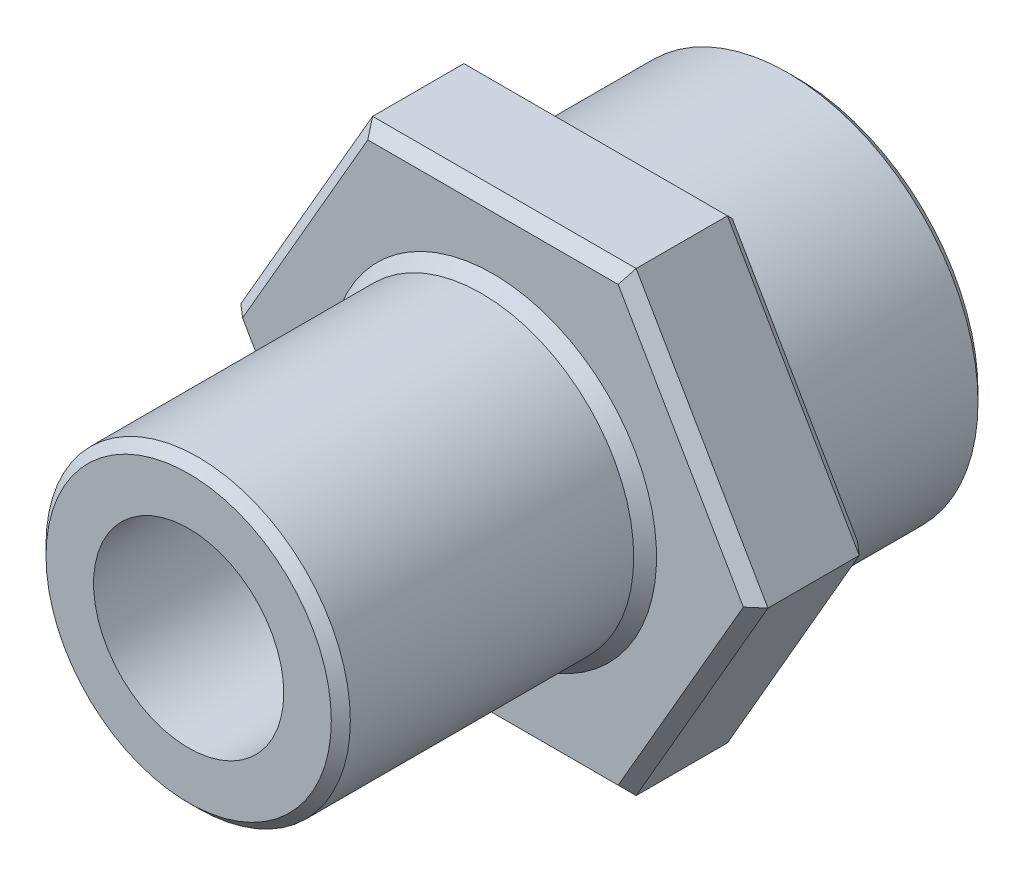
ISO-10303-21;
HEADER;
FILE_DESCRIPTION(('STEP AP214'),'2;1');
FILE_NAME('part.step','',(''),(''),'','','');
FILE_SCHEMA(('AUTOMOTIVE_DESIGN { 1 0 10303 214 1 1 1 1 }'));
ENDSEC;
DATA;
#1=APPLICATION_CONTEXT('core data for automotive mechanical design processes');
#2=APPLICATION_PROTOCOL_DEFINITION('international standard','automotive_design',2000,#1);
#3=PRODUCT_CONTEXT('',#1,'mechanical');
#4=PRODUCT('Part','Part','',(#3));
#5=PRODUCT_RELATED_PRODUCT_CATEGORY('part','',(#4));
#6=PRODUCT_DEFINITION_FORMATION('','',#4);
#7=PRODUCT_DEFINITION_CONTEXT('part definition',#1,'design');
#8=PRODUCT_DEFINITION('design','',#6,#7);
#9=PRODUCT_DEFINITION_SHAPE('','',#8);
#10=(LENGTH_UNIT() NAMED_UNIT(*) SI_UNIT(.MILLI.,.METRE.));
#11=(NAMED_UNIT(*) PLANE_ANGLE_UNIT() SI_UNIT($,.RADIAN.));
#12=(NAMED_UNIT(*) SI_UNIT($,.STERADIAN.) SOLID_ANGLE_UNIT());
#13=UNCERTAINTY_MEASURE_WITH_UNIT(LENGTH_MEASURE(1.E-05),#10,'distance_accuracy_value','');
#14=(GEOMETRIC_REPRESENTATION_CONTEXT(3) GLOBAL_UNCERTAINTY_ASSIGNED_CONTEXT((#13)) GLOBAL_UNIT_ASSIGNED_CONTEXT((#10,
#11,#12)) REPRESENTATION_CONTEXT('',''));
#15=CARTESIAN_POINT('',(0.,0.,0.));
#16=DIRECTION('',(0.,0.,1.));
#17=DIRECTION('',(1.,0.,0.));
#18=AXIS2_PLACEMENT_3D('',#15,#16,#17);
#19=CARTESIAN_POINT('',(0.,0.,8.));
#20=DIRECTION('',(0.,0.,-1.));
#21=DIRECTION('',(-1.,0.,0.));
#22=AXIS2_PLACEMENT_3D('',#19,#20,#21);
#23=CYLINDRICAL_SURFACE('',#22,4.);
#24=CARTESIAN_POINT('',(0.,0.,7.74999999999999));
#25=DIRECTION('',(0.,0.,1.));
#26=DIRECTION('',(1.,0.,0.));
#27=AXIS2_PLACEMENT_3D('',#24,#25,#26);
#28=CIRCLE('',#27,4.);
#29=CARTESIAN_POINT('',(4.,0.,7.74999999999999));
#30=VERTEX_POINT('',#29);
#31=EDGE_CURVE('E11',#30,#30,#28,.F.);
#32=ORIENTED_EDGE('',*,*,#31,.T.);
#33=EDGE_LOOP('',(#32));
#34=FACE_BOUND('',#33,.T.);
#35=CARTESIAN_POINT('',(0.,0.,0.299999999999998));
#36=DIRECTION('',(0.,0.,-1.));
#37=DIRECTION('',(-1.,0.,0.));
#38=AXIS2_PLACEMENT_3D('',#35,#36,#37);
#39=CIRCLE('',#38,4.);
#40=CARTESIAN_POINT('',(-4.,0.,0.299999999999998));
#41=VERTEX_POINT('',#40);
#42=EDGE_CURVE('E241',#41,#41,#39,.F.);
#43=ORIENTED_EDGE('',*,*,#42,.T.);
#44=EDGE_LOOP('',(#43));
#45=FACE_BOUND('',#44,.T.);
#46=ADVANCED_FACE('F44',(#34,#45),#23,.T.);
#47=CARTESIAN_POINT('',(0.,0.,8.));
#48=DIRECTION('',(0.,0.,1.));
#49=DIRECTION('',(1.,0.,0.));
#50=AXIS2_PLACEMENT_3D('',#47,#48,#49);
#51=PLANE('',#50);
#52=CARTESIAN_POINT('',(0.,0.,8.));
#53=DIRECTION('',(0.,0.,1.));
#54=DIRECTION('',(1.,0.,0.));
#55=AXIS2_PLACEMENT_3D('',#52,#53,#54);
#56=CIRCLE('',#55,3.74999999999999);
#57=CARTESIAN_POINT('',(3.74999999999999,0.,8.));
#58=VERTEX_POINT('',#57);
#59=EDGE_CURVE('E54',#58,#58,#56,.T.);
#60=ORIENTED_EDGE('',*,*,#59,.T.);
#61=EDGE_LOOP('',(#60));
#62=FACE_BOUND('',#61,.T.);
#63=CARTESIAN_POINT('',(0.,0.,8.));
#64=DIRECTION('',(0.,0.,1.));
#65=DIRECTION('',(1.,0.,0.));
#66=AXIS2_PLACEMENT_3D('',#63,#64,#65);
#67=CIRCLE('',#66,2.5);
#68=CARTESIAN_POINT('',(2.5,0.,8.));
#69=VERTEX_POINT('',#68);
#70=EDGE_CURVE('E229',#69,#69,#67,.T.);
#71=ORIENTED_EDGE('',*,*,#70,.F.);
#72=EDGE_LOOP('',(#71));
#73=FACE_BOUND('',#72,.T.);
#74=ADVANCED_FACE('F461',(#62,#73),#51,.T.);
#75=CARTESIAN_POINT('',(-3.46410161513776,6.,-3.));
#76=DIRECTION('',(0.,-1.,0.));
#77=DIRECTION('',(1.,0.,0.));
#78=AXIS2_PLACEMENT_3D('',#75,#76,#77);
#79=PLANE('',#78);
#80=DIRECTION('',(0.,0.,1.));
#81=VECTOR('',#80,1.);
#82=CARTESIAN_POINT('',(-3.46410161513776,6.,-3.));
#83=LINE('',#82,#81);
#84=CARTESIAN_POINT('',(-3.46410161513776,6.,-2.7));
#85=VERTEX_POINT('',#84);
#86=CARTESIAN_POINT('',(-3.46410161513776,6.,-0.300000000000002));
#87=VERTEX_POINT('',#86);
#88=EDGE_CURVE('E236',#85,#87,#83,.T.);
#89=ORIENTED_EDGE('',*,*,#88,.T.);
#90=DIRECTION('',(1.,0.,0.));
#91=VECTOR('',#90,1.);
#92=CARTESIAN_POINT('',(-3.46410161513776,6.,-0.300000000000002));
#93=LINE('',#92,#91);
#94=CARTESIAN_POINT('',(3.46410161513776,6.,-0.300000000000002));
#95=VERTEX_POINT('',#94);
#96=EDGE_CURVE('E331',#87,#95,#93,.T.);
#97=ORIENTED_EDGE('',*,*,#96,.T.);
#98=DIRECTION('',(0.,0.,1.));
#99=VECTOR('',#98,1.);
#100=CARTESIAN_POINT('',(3.46410161513776,6.,-3.));
#101=LINE('',#100,#99);
#102=CARTESIAN_POINT('',(3.46410161513776,6.,-2.7));
#103=VERTEX_POINT('',#102);
#104=EDGE_CURVE('E242',#103,#95,#101,.T.);
#105=ORIENTED_EDGE('',*,*,#104,.F.);
#106=DIRECTION('',(-1.,0.,0.));
#107=VECTOR('',#106,1.);
#108=CARTESIAN_POINT('',(-3.46410161513776,6.,-2.7));
#109=LINE('',#108,#107);
#110=EDGE_CURVE('E328',#103,#85,#109,.T.);
#111=ORIENTED_EDGE('',*,*,#110,.T.);
#112=EDGE_LOOP('',(#89,#97,#105,#111));
#113=FACE_BOUND('',#112,.T.);
#114=ADVANCED_FACE('F479',(#113),#79,.F.);
#115=CARTESIAN_POINT('',(3.46410161513776,6.,-3.));
#116=DIRECTION('',(-0.866025403784439,-0.5,0.));
#117=DIRECTION('',(0.5,-0.866025403784439,0.));
#118=AXIS2_PLACEMENT_3D('',#115,#116,#117);
#119=PLANE('',#118);
#120=ORIENTED_EDGE('',*,*,#104,.T.);
#121=DIRECTION('',(0.5,-0.866025403784439,0.));
#122=VECTOR('',#121,1.);
#123=CARTESIAN_POINT('',(3.46410161513776,6.,-0.300000000000002));
#124=LINE('',#123,#122);
#125=CARTESIAN_POINT('',(6.92820323027551,0.,-0.300000000000002));
#126=VERTEX_POINT('',#125);
#127=EDGE_CURVE('E280',#95,#126,#124,.T.);
#128=ORIENTED_EDGE('',*,*,#127,.T.);
#129=DIRECTION('',(0.,0.,1.));
#130=VECTOR('',#129,1.);
#131=CARTESIAN_POINT('',(6.92820323027551,0.,-3.));
#132=LINE('',#131,#130);
#133=CARTESIAN_POINT('',(6.92820323027551,0.,-2.7));
#134=VERTEX_POINT('',#133);
#135=EDGE_CURVE('E258',#134,#126,#132,.T.);
#136=ORIENTED_EDGE('',*,*,#135,.F.);
#137=DIRECTION('',(-0.5,0.866025403784439,0.));
#138=VECTOR('',#137,1.);
#139=CARTESIAN_POINT('',(3.46410161513776,6.,-2.7));
#140=LINE('',#139,#138);
#141=EDGE_CURVE('E218',#134,#103,#140,.T.);
#142=ORIENTED_EDGE('',*,*,#141,.T.);
#143=EDGE_LOOP('',(#120,#128,#136,#142));
#144=FACE_BOUND('',#143,.T.);
#145=ADVANCED_FACE('F530',(#144),#119,.F.);
#146=CARTESIAN_POINT('',(6.92820323027551,0.,-3.));
#147=DIRECTION('',(-0.866025403784439,0.5,0.));
#148=DIRECTION('',(-0.5,-0.866025403784439,0.));
#149=AXIS2_PLACEMENT_3D('',#146,#147,#148);
#150=PLANE('',#149);
#151=ORIENTED_EDGE('',*,*,#135,.T.);
#152=DIRECTION('',(-0.5,-0.866025403784439,0.));
#153=VECTOR('',#152,1.);
#154=CARTESIAN_POINT('',(6.92820323027551,0.,-0.300000000000002));
#155=LINE('',#154,#153);
#156=CARTESIAN_POINT('',(3.46410161513776,-6.,-0.300000000000002));
#157=VERTEX_POINT('',#156);
#158=EDGE_CURVE('E306',#126,#157,#155,.T.);
#159=ORIENTED_EDGE('',*,*,#158,.T.);
#160=DIRECTION('',(0.,0.,1.));
#161=VECTOR('',#160,1.);
#162=CARTESIAN_POINT('',(3.46410161513776,-6.,-3.));
#163=LINE('',#162,#161);
#164=CARTESIAN_POINT('',(3.46410161513776,-6.,-2.7));
#165=VERTEX_POINT('',#164);
#166=EDGE_CURVE('E254',#165,#157,#163,.T.);
#167=ORIENTED_EDGE('',*,*,#166,.F.);
#168=DIRECTION('',(0.5,0.866025403784439,0.));
#169=VECTOR('',#168,1.);
#170=CARTESIAN_POINT('',(6.92820323027551,0.,-2.7));
#171=LINE('',#170,#169);
#172=EDGE_CURVE('E303',#165,#134,#171,.T.);
#173=ORIENTED_EDGE('',*,*,#172,.T.);
#174=EDGE_LOOP('',(#151,#159,#167,#173));
#175=FACE_BOUND('',#174,.T.);
#176=ADVANCED_FACE('F526',(#175),#150,.F.);
#177=CARTESIAN_POINT('',(3.46410161513776,-6.,-3.));
#178=DIRECTION('',(0.,1.,0.));
#179=DIRECTION('',(0.,0.,1.));
#180=AXIS2_PLACEMENT_3D('',#177,#178,#179);
#181=PLANE('',#180);
#182=ORIENTED_EDGE('',*,*,#166,.T.);
#183=DIRECTION('',(-1.,0.,0.));
#184=VECTOR('',#183,1.);
#185=CARTESIAN_POINT('',(3.46410161513776,-6.,-0.300000000000002));
#186=LINE('',#185,#184);
#187=CARTESIAN_POINT('',(-3.46410161513775,-6.,-0.300000000000002));
#188=VERTEX_POINT('',#187);
#189=EDGE_CURVE('E312',#157,#188,#186,.T.);
#190=ORIENTED_EDGE('',*,*,#189,.T.);
#191=DIRECTION('',(0.,0.,1.));
#192=VECTOR('',#191,1.);
#193=CARTESIAN_POINT('',(-3.46410161513775,-6.,-3.));
#194=LINE('',#193,#192);
#195=CARTESIAN_POINT('',(-3.46410161513775,-6.,-2.7));
#196=VERTEX_POINT('',#195);
#197=EDGE_CURVE('E250',#196,#188,#194,.T.);
#198=ORIENTED_EDGE('',*,*,#197,.F.);
#199=DIRECTION('',(1.,0.,0.));
#200=VECTOR('',#199,1.);
#201=CARTESIAN_POINT('',(3.46410161513776,-6.,-2.7));
#202=LINE('',#201,#200);
#203=EDGE_CURVE('E309',#196,#165,#202,.T.);
#204=ORIENTED_EDGE('',*,*,#203,.T.);
#205=EDGE_LOOP('',(#182,#190,#198,#204));
#206=FACE_BOUND('',#205,.T.);
#207=ADVANCED_FACE('F522',(#206),#181,.F.);
#208=CARTESIAN_POINT('',(-3.46410161513775,-6.,-3.));
#209=DIRECTION('',(0.866025403784438,0.5,0.));
#210=DIRECTION('',(-0.5,0.866025403784439,0.));
#211=AXIS2_PLACEMENT_3D('',#208,#209,#210);
#212=PLANE('',#211);
#213=ORIENTED_EDGE('',*,*,#197,.T.);
#214=DIRECTION('',(-0.5,0.866025403784439,0.));
#215=VECTOR('',#214,1.);
#216=CARTESIAN_POINT('',(-3.46410161513775,-6.,-0.300000000000002));
#217=LINE('',#216,#215);
#218=CARTESIAN_POINT('',(-6.92820323027551,0.,-0.300000000000002));
#219=VERTEX_POINT('',#218);
#220=EDGE_CURVE('E318',#188,#219,#217,.T.);
#221=ORIENTED_EDGE('',*,*,#220,.T.);
#222=DIRECTION('',(0.,0.,1.));
#223=VECTOR('',#222,1.);
#224=CARTESIAN_POINT('',(-6.92820323027551,0.,-3.));
#225=LINE('',#224,#223);
#226=CARTESIAN_POINT('',(-6.92820323027551,0.,-2.7));
#227=VERTEX_POINT('',#226);
#228=EDGE_CURVE('E246',#227,#219,#225,.T.);
#229=ORIENTED_EDGE('',*,*,#228,.F.);
#230=DIRECTION('',(0.5,-0.866025403784439,0.));
#231=VECTOR('',#230,1.);
#232=CARTESIAN_POINT('',(-3.46410161513775,-6.,-2.7));
#233=LINE('',#232,#231);
#234=EDGE_CURVE('E315',#227,#196,#233,.T.);
#235=ORIENTED_EDGE('',*,*,#234,.T.);
#236=EDGE_LOOP('',(#213,#221,#229,#235));
#237=FACE_BOUND('',#236,.T.);
#238=ADVANCED_FACE('F518',(#237),#212,.F.);
#239=CARTESIAN_POINT('',(-6.92820323027551,0.,-3.));
#240=DIRECTION('',(0.866025403784439,-0.5,0.));
#241=DIRECTION('',(0.5,0.866025403784439,0.));
#242=AXIS2_PLACEMENT_3D('',#239,#240,#241);
#243=PLANE('',#242);
#244=ORIENTED_EDGE('',*,*,#228,.T.);
#245=DIRECTION('',(0.5,0.866025403784439,0.));
#246=VECTOR('',#245,1.);
#247=CARTESIAN_POINT('',(-6.92820323027551,0.,-0.300000000000002));
#248=LINE('',#247,#246);
#249=EDGE_CURVE('E325',#219,#87,#248,.T.);
#250=ORIENTED_EDGE('',*,*,#249,.T.);
#251=ORIENTED_EDGE('',*,*,#88,.F.);
#252=DIRECTION('',(-0.5,-0.866025403784439,0.));
#253=VECTOR('',#252,1.);
#254=CARTESIAN_POINT('',(-6.92820323027551,0.,-2.7));
#255=LINE('',#254,#253);
#256=EDGE_CURVE('E321',#85,#227,#255,.T.);
#257=ORIENTED_EDGE('',*,*,#256,.T.);
#258=EDGE_LOOP('',(#244,#250,#251,#257));
#259=FACE_BOUND('',#258,.T.);
#260=ADVANCED_FACE('F512',(#259),#243,.F.);
#261=CARTESIAN_POINT('',(0.,0.,-3.));
#262=DIRECTION('',(0.,0.,-1.));
#263=DIRECTION('',(-1.,0.,0.));
#264=AXIS2_PLACEMENT_3D('',#261,#262,#263);
#265=PLANE('',#264);
#266=DIRECTION('',(-0.5,0.866025403784439,0.));
#267=VECTOR('',#266,1.);
#268=CARTESIAN_POINT('',(-6.66839560914018,0.15,-3.));
#269=LINE('',#268,#267);
#270=CARTESIAN_POINT('',(-3.29089653438087,-5.7,-3.));
#271=VERTEX_POINT('',#270);
#272=CARTESIAN_POINT('',(-6.58179306876174,0.,-3.));
#273=VERTEX_POINT('',#272);
#274=EDGE_CURVE('E340',#271,#273,#269,.T.);
#275=ORIENTED_EDGE('',*,*,#274,.T.);
#276=DIRECTION('',(0.5,0.866025403784439,0.));
#277=VECTOR('',#276,1.);
#278=CARTESIAN_POINT('',(-3.20429399400243,5.85,-3.));
#279=LINE('',#278,#277);
#280=CARTESIAN_POINT('',(-3.29089653438087,5.7,-3.));
#281=VERTEX_POINT('',#280);
#282=EDGE_CURVE('E349',#273,#281,#279,.T.);
#283=ORIENTED_EDGE('',*,*,#282,.T.);
#284=DIRECTION('',(1.,0.,0.));
#285=VECTOR('',#284,1.);
#286=CARTESIAN_POINT('',(3.46410161513776,5.7,-3.));
#287=LINE('',#286,#285);
#288=CARTESIAN_POINT('',(3.29089653438087,5.7,-3.));
#289=VERTEX_POINT('',#288);
#290=EDGE_CURVE('E346',#281,#289,#287,.T.);
#291=ORIENTED_EDGE('',*,*,#290,.T.);
#292=DIRECTION('',(0.5,-0.866025403784439,0.));
#293=VECTOR('',#292,1.);
#294=CARTESIAN_POINT('',(6.66839560914018,-0.149999999999998,-3.));
#295=LINE('',#294,#293);
#296=CARTESIAN_POINT('',(6.58179306876174,0.,-3.));
#297=VERTEX_POINT('',#296);
#298=EDGE_CURVE('E343',#289,#297,#295,.T.);
#299=ORIENTED_EDGE('',*,*,#298,.T.);
#300=DIRECTION('',(-0.5,-0.866025403784439,0.));
#301=VECTOR('',#300,1.);
#302=CARTESIAN_POINT('',(3.20429399400243,-5.85,-3.));
#303=LINE('',#302,#301);
#304=CARTESIAN_POINT('',(3.29089653438087,-5.7,-3.));
#305=VERTEX_POINT('',#304);
#306=EDGE_CURVE('E337',#297,#305,#303,.T.);
#307=ORIENTED_EDGE('',*,*,#306,.T.);
#308=DIRECTION('',(-1.,0.,0.));
#309=VECTOR('',#308,1.);
#310=CARTESIAN_POINT('',(-3.46410161513775,-5.7,-3.));
#311=LINE('',#310,#309);
#312=EDGE_CURVE('E334',#305,#271,#311,.T.);
#313=ORIENTED_EDGE('',*,*,#312,.T.);
#314=EDGE_LOOP('',(#275,#283,#291,#299,#307,#313));
#315=FACE_BOUND('',#314,.T.);
#316=CARTESIAN_POINT('',(0.,0.,-3.));
#317=DIRECTION('',(0.,0.,-1.));
#318=DIRECTION('',(-1.,0.,0.));
#319=AXIS2_PLACEMENT_3D('',#316,#317,#318);
#320=CIRCLE('',#319,5.);
#321=CARTESIAN_POINT('',(-5.,0.,-3.));
#322=VERTEX_POINT('',#321);
#323=EDGE_CURVE('E237',#322,#322,#320,.T.);
#324=ORIENTED_EDGE('',*,*,#323,.F.);
#325=EDGE_LOOP('',(#324));
#326=FACE_BOUND('',#325,.T.);
#327=ADVANCED_FACE('F503',(#315,#326),#265,.T.);
#328=CARTESIAN_POINT('',(0.,0.,0.));
#329=DIRECTION('',(0.,0.,-1.));
#330=DIRECTION('',(-1.,0.,0.));
#331=AXIS2_PLACEMENT_3D('',#328,#329,#330);
#332=PLANE('',#331);
#333=DIRECTION('',(0.5,0.866025403784439,0.));
#334=VECTOR('',#333,1.);
#335=CARTESIAN_POINT('',(4.9363448015713,-2.85,0.));
#336=LINE('',#335,#334);
#337=CARTESIAN_POINT('',(3.29089653438087,-5.7,0.));
#338=VERTEX_POINT('',#337);
#339=CARTESIAN_POINT('',(6.58179306876173,0.,0.));
#340=VERTEX_POINT('',#339);
#341=EDGE_CURVE('E296',#338,#340,#336,.T.);
#342=ORIENTED_EDGE('',*,*,#341,.T.);
#343=DIRECTION('',(-0.5,0.866025403784439,0.));
#344=VECTOR('',#343,1.);
#345=CARTESIAN_POINT('',(4.9363448015713,2.85,0.));
#346=LINE('',#345,#344);
#347=CARTESIAN_POINT('',(3.29089653438087,5.7,0.));
#348=VERTEX_POINT('',#347);
#349=EDGE_CURVE('E299',#340,#348,#346,.T.);
#350=ORIENTED_EDGE('',*,*,#349,.T.);
#351=DIRECTION('',(-1.,0.,0.));
#352=VECTOR('',#351,1.);
#353=CARTESIAN_POINT('',(0.,5.7,0.));
#354=LINE('',#353,#352);
#355=CARTESIAN_POINT('',(-3.29089653438087,5.7,0.));
#356=VERTEX_POINT('',#355);
#357=EDGE_CURVE('E284',#348,#356,#354,.T.);
#358=ORIENTED_EDGE('',*,*,#357,.T.);
#359=DIRECTION('',(-0.5,-0.866025403784439,0.));
#360=VECTOR('',#359,1.);
#361=CARTESIAN_POINT('',(-4.9363448015713,2.85,0.));
#362=LINE('',#361,#360);
#363=CARTESIAN_POINT('',(-6.58179306876173,0.,0.));
#364=VERTEX_POINT('',#363);
#365=EDGE_CURVE('E287',#356,#364,#362,.T.);
#366=ORIENTED_EDGE('',*,*,#365,.T.);
#367=DIRECTION('',(0.5,-0.866025403784439,0.));
#368=VECTOR('',#367,1.);
#369=CARTESIAN_POINT('',(-4.9363448015713,-2.85,0.));
#370=LINE('',#369,#368);
#371=CARTESIAN_POINT('',(-3.29089653438086,-5.7,0.));
#372=VERTEX_POINT('',#371);
#373=EDGE_CURVE('E290',#364,#372,#370,.T.);
#374=ORIENTED_EDGE('',*,*,#373,.T.);
#375=DIRECTION('',(1.,0.,0.));
#376=VECTOR('',#375,1.);
#377=CARTESIAN_POINT('',(0.,-5.7,0.));
#378=LINE('',#377,#376);
#379=EDGE_CURVE('E293',#372,#338,#378,.T.);
#380=ORIENTED_EDGE('',*,*,#379,.T.);
#381=EDGE_LOOP('',(#342,#350,#358,#366,#374,#380));
#382=FACE_BOUND('',#381,.T.);
#383=CARTESIAN_POINT('',(0.,0.,0.));
#384=DIRECTION('',(0.,0.,-1.));
#385=DIRECTION('',(-1.,0.,0.));
#386=AXIS2_PLACEMENT_3D('',#383,#384,#385);
#387=CIRCLE('',#386,4.3);
#388=CARTESIAN_POINT('',(-4.3,0.,0.));
#389=VERTEX_POINT('',#388);
#390=EDGE_CURVE('E268',#389,#389,#387,.T.);
#391=ORIENTED_EDGE('',*,*,#390,.T.);
#392=EDGE_LOOP('',(#391));
#393=FACE_BOUND('',#392,.T.);
#394=ADVANCED_FACE('F500',(#382,#393),#332,.F.);
#395=CARTESIAN_POINT('',(0.,0.,-8.));
#396=DIRECTION('',(0.,0.,1.));
#397=DIRECTION('',(1.,0.,0.));
#398=AXIS2_PLACEMENT_3D('',#395,#396,#397);
#399=CYLINDRICAL_SURFACE('',#398,5.);
#400=DIRECTION('',(0.,0.,1.));
#401=VECTOR('',#400,1.);
#402=CARTESIAN_POINT('',(1.72376951906394,-4.69346552614867,-8.));
#403=LINE('',#402,#401);
#404=CARTESIAN_POINT('',(1.72376951906395,-4.69346552614867,-4.7));
#405=VERTEX_POINT('',#404);
#406=CARTESIAN_POINT('',(1.72376951906394,-4.69346552614867,-7.75));
#407=VERTEX_POINT('',#406);
#408=EDGE_CURVE('E784',#405,#407,#403,.F.);
#409=ORIENTED_EDGE('',*,*,#408,.T.);
#410=CARTESIAN_POINT('',(0.,0.,-7.75));
#411=DIRECTION('',(0.,0.,-1.));
#412=DIRECTION('',(-1.,0.,0.));
#413=AXIS2_PLACEMENT_3D('',#410,#411,#412);
#414=CIRCLE('',#413,5.);
#415=CARTESIAN_POINT('',(-1.72376951906394,-4.69346552614867,-7.75));
#416=VERTEX_POINT('',#415);
#417=EDGE_CURVE('E69',#407,#416,#414,.F.);
#418=ORIENTED_EDGE('',*,*,#417,.T.);
#419=DIRECTION('',(0.,0.,1.));
#420=VECTOR('',#419,1.);
#421=CARTESIAN_POINT('',(-1.72376951906394,-4.69346552614867,-8.));
#422=LINE('',#421,#420);
#423=CARTESIAN_POINT('',(-1.72376951906395,-4.69346552614867,-4.7));
#424=VERTEX_POINT('',#423);
#425=EDGE_CURVE('E730',#416,#424,#422,.T.);
#426=ORIENTED_EDGE('',*,*,#425,.T.);
#427=CARTESIAN_POINT('',(0.,0.,-4.7));
#428=DIRECTION('',(0.,0.,1.));
#429=DIRECTION('',(1.,0.,0.));
#430=AXIS2_PLACEMENT_3D('',#427,#428,#429);
#431=CIRCLE('',#430,5.);
#432=EDGE_CURVE('E789',#424,#405,#431,.T.);
#433=ORIENTED_EDGE('',*,*,#432,.T.);
#434=EDGE_LOOP('',(#409,#418,#426,#433));
#435=FACE_BOUND('',#434,.T.);
#436=ORIENTED_EDGE('',*,*,#323,.T.);
#437=EDGE_LOOP('',(#436));
#438=FACE_BOUND('',#437,.T.);
#439=ADVANCED_FACE('F502',(#435,#438),#399,.T.);
#440=CARTESIAN_POINT('',(0.,0.,-8.));
#441=DIRECTION('',(0.,0.,-1.));
#442=DIRECTION('',(-1.,0.,0.));
#443=AXIS2_PLACEMENT_3D('',#440,#441,#442);
#444=PLANE('',#443);
#445=DIRECTION('',(0.,-1.,0.));
#446=VECTOR('',#445,1.);
#447=CARTESIAN_POINT('',(-1.8,-4.76969600708473,-8.));
#448=LINE('',#447,#446);
#449=CARTESIAN_POINT('',(-1.8,-2.14476105895272,-8.));
#450=VERTEX_POINT('',#449);
#451=CARTESIAN_POINT('',(-1.8,-4.39573657081495,-8.));
#452=VERTEX_POINT('',#451);
#453=EDGE_CURVE('E353',#450,#452,#448,.T.);
#454=ORIENTED_EDGE('',*,*,#453,.T.);
#455=CARTESIAN_POINT('',(0.,0.,-8.));
#456=DIRECTION('',(0.,0.,-1.));
#457=DIRECTION('',(-1.,0.,0.));
#458=AXIS2_PLACEMENT_3D('',#455,#456,#457);
#459=CIRCLE('',#458,4.75);
#460=CARTESIAN_POINT('',(1.8,-4.39573657081495,-8.));
#461=VERTEX_POINT('',#460);
#462=EDGE_CURVE('E684',#452,#461,#459,.T.);
#463=ORIENTED_EDGE('',*,*,#462,.T.);
#464=DIRECTION('',(0.,1.,0.));
#465=VECTOR('',#464,1.);
#466=CARTESIAN_POINT('',(1.8,-2.36431808350737,-8.));
#467=LINE('',#466,#465);
#468=CARTESIAN_POINT('',(1.8,-2.14476105895272,-8.));
#469=VERTEX_POINT('',#468);
#470=EDGE_CURVE('E402',#461,#469,#467,.T.);
#471=ORIENTED_EDGE('',*,*,#470,.T.);
#472=CARTESIAN_POINT('',(0.,0.,-8.));
#473=DIRECTION('',(0.,0.,-1.));
#474=DIRECTION('',(-1.,0.,0.));
#475=AXIS2_PLACEMENT_3D('',#472,#473,#474);
#476=CIRCLE('',#475,2.8);
#477=EDGE_CURVE('E272',#469,#450,#476,.F.);
#478=ORIENTED_EDGE('',*,*,#477,.T.);
#479=EDGE_LOOP('',(#454,#463,#471,#478));
#480=FACE_BOUND('',#479,.T.);
#481=ADVANCED_FACE('F494',(#480),#444,.T.);
#482=CARTESIAN_POINT('',(0.,0.,-8.));
#483=DIRECTION('',(0.,0.,1.));
#484=DIRECTION('',(1.,0.,0.));
#485=AXIS2_PLACEMENT_3D('',#482,#483,#484);
#486=CYLINDRICAL_SURFACE('',#485,2.5);
#487=CARTESIAN_POINT('',(0.,0.,-5.));
#488=DIRECTION('',(0.,0.,1.));
#489=DIRECTION('',(1.,0.,0.));
#490=AXIS2_PLACEMENT_3D('',#487,#488,#489);
#491=CIRCLE('',#490,2.5);
#492=CARTESIAN_POINT('',(1.5,-2.,-5.));
#493=VERTEX_POINT('',#492);
#494=CARTESIAN_POINT('',(-1.5,-2.,-5.));
#495=VERTEX_POINT('',#494);
#496=EDGE_CURVE('E211',#493,#495,#491,.F.);
#497=ORIENTED_EDGE('',*,*,#496,.T.);
#498=DIRECTION('',(0.,0.,1.));
#499=VECTOR('',#498,1.);
#500=CARTESIAN_POINT('',(-1.5,-2.,-8.));
#501=LINE('',#500,#499);
#502=CARTESIAN_POINT('',(-1.5,-2.00000000000019,-7.70000000000009));
#503=VERTEX_POINT('',#502);
#504=EDGE_CURVE('E226',#495,#503,#501,.F.);
#505=ORIENTED_EDGE('',*,*,#504,.T.);
#506=CARTESIAN_POINT('',(0.,0.,-7.7));
#507=DIRECTION('',(0.,0.,-1.));
#508=DIRECTION('',(-1.,0.,0.));
#509=AXIS2_PLACEMENT_3D('',#506,#507,#508);
#510=CIRCLE('',#509,2.5);
#511=CARTESIAN_POINT('',(1.5,-2.,-7.7));
#512=VERTEX_POINT('',#511);
#513=EDGE_CURVE('E219',#503,#512,#510,.T.);
#514=ORIENTED_EDGE('',*,*,#513,.T.);
#515=DIRECTION('',(0.,0.,1.));
#516=VECTOR('',#515,1.);
#517=CARTESIAN_POINT('',(1.5,-2.,-8.));
#518=LINE('',#517,#516);
#519=EDGE_CURVE('E201',#512,#493,#518,.T.);
#520=ORIENTED_EDGE('',*,*,#519,.T.);
#521=EDGE_LOOP('',(#497,#505,#514,#520));
#522=FACE_BOUND('',#521,.T.);
#523=ORIENTED_EDGE('',*,*,#70,.T.);
#524=EDGE_LOOP('',(#523));
#525=FACE_BOUND('',#524,.T.);
#526=ADVANCED_FACE('F221',(#522,#525),#486,.F.);
#527=CARTESIAN_POINT('',(0.,0.,0.299999999999998));
#528=DIRECTION('',(0.,0.,-1.));
#529=DIRECTION('',(-1.,0.,0.));
#530=AXIS2_PLACEMENT_3D('',#527,#528,#529);
#531=CONICAL_SURFACE('',#530,4.,0.785398163397448);
#532=ORIENTED_EDGE('',*,*,#390,.F.);
#533=EDGE_LOOP('',(#532));
#534=FACE_BOUND('',#533,.T.);
#535=ORIENTED_EDGE('',*,*,#42,.F.);
#536=EDGE_LOOP('',(#535));
#537=FACE_BOUND('',#536,.T.);
#538=ADVANCED_FACE('F484',(#534,#537),#531,.T.);
#539=CARTESIAN_POINT('',(0.,0.,-8.));
#540=DIRECTION('',(0.,0.,-1.));
#541=DIRECTION('',(-1.,0.,0.));
#542=AXIS2_PLACEMENT_3D('',#539,#540,#541);
#543=CONICAL_SURFACE('',#542,2.8,0.785398163397449);
#544=ORIENTED_EDGE('',*,*,#477,.F.);
#545=CARTESIAN_POINT('',(1.8,-2.14476105895272,-8.));
#546=CARTESIAN_POINT('',(1.74981801903348,-2.1213888565178,-7.94981801903349));
#547=CARTESIAN_POINT('',(1.69972706871627,-2.09763935378187,-7.89972706871627));
#548=CARTESIAN_POINT('',(1.59972706812904,-2.04938566989824,-7.79972706812904));
#549=CARTESIAN_POINT('',(1.54981801844618,-2.02488148631693,-7.74981801844618));
#550=CARTESIAN_POINT('',(1.49999999999977,-2.00000000000099,-7.69999999999977));
#551=B_SPLINE_CURVE_WITH_KNOTS('',3,(#545,#546,#547,#548,#549,#550),.UNSPECIFIED.,.F.,.F.,(4,2,
4),(0.,0.224143278703843,0.448287280277188),.UNSPECIFIED.);
#552=EDGE_CURVE('E414',#469,#512,#551,.T.);
#553=ORIENTED_EDGE('',*,*,#552,.T.);
#554=ORIENTED_EDGE('',*,*,#513,.F.);
#555=CARTESIAN_POINT('',(-1.5,-2.00000000000019,-7.7));
#556=CARTESIAN_POINT('',(-1.54981801844636,-2.02488148631629,-7.74981801844636));
#557=CARTESIAN_POINT('',(-1.59972706812915,-2.04938566989787,-7.79972706812915));
#558=CARTESIAN_POINT('',(-1.69972706871618,-2.09763935378224,-7.89972706871618));
#559=CARTESIAN_POINT('',(-1.74981801903327,-2.12138885651865,-7.94981801903327));
#560=CARTESIAN_POINT('',(-1.79999999999964,-2.14476105895415,-7.99999999999964));
#561=B_SPLINE_CURVE_WITH_KNOTS('',3,(#555,#556,#557,#558,#559,#560),.UNSPECIFIED.,.F.,.F.,(4,2,
4),(0.,0.224144001573317,0.448287280277118),.UNSPECIFIED.);
#562=EDGE_CURVE('E405',#503,#450,#561,.T.);
#563=ORIENTED_EDGE('',*,*,#562,.T.);
#564=EDGE_LOOP('',(#544,#553,#554,#563));
#565=FACE_BOUND('',#564,.T.);
#566=ADVANCED_FACE('F422',(#565),#543,.F.);
#567=CARTESIAN_POINT('',(-1.5,-6.,-5.));
#568=DIRECTION('',(0.,0.,1.));
#569=DIRECTION('',(1.,0.,0.));
#570=AXIS2_PLACEMENT_3D('',#567,#568,#569);
#571=PLANE('',#570);
#572=DIRECTION('',(0.,1.,0.));
#573=VECTOR('',#572,1.);
#574=CARTESIAN_POINT('',(1.5,-6.,-5.));
#575=LINE('',#574,#573);
#576=CARTESIAN_POINT('',(1.5,-4.45421149026402,-5.));
#577=VERTEX_POINT('',#576);
#578=EDGE_CURVE('E196',#577,#493,#575,.T.);
#579=ORIENTED_EDGE('',*,*,#578,.F.);
#580=CARTESIAN_POINT('',(0.,0.,-5.));
#581=DIRECTION('',(0.,0.,1.));
#582=DIRECTION('',(1.,0.,0.));
#583=AXIS2_PLACEMENT_3D('',#580,#581,#582);
#584=CIRCLE('',#583,4.7);
#585=CARTESIAN_POINT('',(-1.5,-4.45421149026402,-5.));
#586=VERTEX_POINT('',#585);
#587=EDGE_CURVE('E735',#577,#586,#584,.F.);
#588=ORIENTED_EDGE('',*,*,#587,.T.);
#589=DIRECTION('',(0.,1.,0.));
#590=VECTOR('',#589,1.);
#591=CARTESIAN_POINT('',(-1.5,-6.,-5.));
#592=LINE('',#591,#590);
#593=EDGE_CURVE('E208',#586,#495,#592,.T.);
#594=ORIENTED_EDGE('',*,*,#593,.T.);
#595=ORIENTED_EDGE('',*,*,#496,.F.);
#596=EDGE_LOOP('',(#579,#588,#594,#595));
#597=FACE_BOUND('',#596,.T.);
#598=ADVANCED_FACE('F212',(#597),#571,.F.);
#599=CARTESIAN_POINT('',(-1.5,-6.,-8.));
#600=DIRECTION('',(-1.,0.,0.));
#601=DIRECTION('',(0.,0.,1.));
#602=AXIS2_PLACEMENT_3D('',#599,#600,#601);
#603=PLANE('',#602);
#604=DIRECTION('',(0.,0.,-1.));
#605=VECTOR('',#604,1.);
#606=CARTESIAN_POINT('',(-1.5,-4.46969600708473,-8.));
#607=LINE('',#606,#605);
#608=CARTESIAN_POINT('',(-1.5,-4.46969600708473,-4.98532266260467));
#609=VERTEX_POINT('',#608);
#610=CARTESIAN_POINT('',(-1.5,-4.46969600708473,-7.7));
#611=VERTEX_POINT('',#610);
#612=EDGE_CURVE('E720',#609,#611,#607,.T.);
#613=ORIENTED_EDGE('',*,*,#612,.T.);
#614=DIRECTION('',(0.,1.,0.));
#615=VECTOR('',#614,1.);
#616=CARTESIAN_POINT('',(-1.5,-2.36431808350737,-7.7));
#617=LINE('',#616,#615);
#618=EDGE_CURVE('E726',#611,#503,#617,.T.);
#619=ORIENTED_EDGE('',*,*,#618,.T.);
#620=ORIENTED_EDGE('',*,*,#504,.F.);
#621=ORIENTED_EDGE('',*,*,#593,.F.);
#622=CARTESIAN_POINT('',(-1.5,-4.45421149026402,-5.));
#623=CARTESIAN_POINT('',(-1.5,-4.45679245825613,-4.99755400412371));
#624=CARTESIAN_POINT('',(-1.5,-4.45937331865392,-4.99510789473595));
#625=CARTESIAN_POINT('',(-1.5,-4.46453482426082,-4.99021544893751));
#626=CARTESIAN_POINT('',(-1.5,-4.46711546946994,-4.98776911252683));
#627=CARTESIAN_POINT('',(-1.5,-4.46969600708474,-4.98532266260468));
#628=B_SPLINE_CURVE_WITH_KNOTS('',3,(#622,#623,#624,#625,#626,#627),.UNSPECIFIED.,.F.,.F.,(4,2,
4),(0.,0.0106676437776873,0.02133528755531),.UNSPECIFIED.);
#629=EDGE_CURVE('E728',#586,#609,#628,.T.);
#630=ORIENTED_EDGE('',*,*,#629,.T.);
#631=EDGE_LOOP('',(#613,#619,#620,#621,#630));
#632=FACE_BOUND('',#631,.T.);
#633=ADVANCED_FACE('F725',(#632),#603,.F.);
#634=CARTESIAN_POINT('',(1.5,-6.,-8.));
#635=DIRECTION('',(1.,0.,0.));
#636=DIRECTION('',(0.,0.,-1.));
#637=AXIS2_PLACEMENT_3D('',#634,#635,#636);
#638=PLANE('',#637);
#639=ORIENTED_EDGE('',*,*,#519,.F.);
#640=DIRECTION('',(0.,-1.,0.));
#641=VECTOR('',#640,1.);
#642=CARTESIAN_POINT('',(1.5,-4.76969600708473,-7.7));
#643=LINE('',#642,#641);
#644=CARTESIAN_POINT('',(1.5,-4.46969600708473,-7.7));
#645=VERTEX_POINT('',#644);
#646=EDGE_CURVE('E781',#512,#645,#643,.T.);
#647=ORIENTED_EDGE('',*,*,#646,.T.);
#648=DIRECTION('',(0.,0.,1.));
#649=VECTOR('',#648,1.);
#650=CARTESIAN_POINT('',(1.5,-4.46969600708473,-8.));
#651=LINE('',#650,#649);
#652=CARTESIAN_POINT('',(1.5,-4.46969600708473,-4.98532266260467));
#653=VERTEX_POINT('',#652);
#654=EDGE_CURVE('E777',#645,#653,#651,.T.);
#655=ORIENTED_EDGE('',*,*,#654,.T.);
#656=CARTESIAN_POINT('',(1.5,-4.46969600708473,-4.98532266260467));
#657=CARTESIAN_POINT('',(1.5,-4.46711546946994,-4.98776911252682));
#658=CARTESIAN_POINT('',(1.5,-4.46453482426082,-4.99021544893751));
#659=CARTESIAN_POINT('',(1.5,-4.45937331865392,-4.99510789473595));
#660=CARTESIAN_POINT('',(1.5,-4.45679245825614,-4.99755400412372));
#661=CARTESIAN_POINT('',(1.5,-4.45421149026403,-5.00000000000001));
#662=B_SPLINE_CURVE_WITH_KNOTS('',3,(#656,#657,#658,#659,#660,#661),.UNSPECIFIED.,.F.,.F.,(4,2,
4),(0.,0.0106676437776242,0.0213352875553118),.UNSPECIFIED.);
#663=EDGE_CURVE('E204',#653,#577,#662,.T.);
#664=ORIENTED_EDGE('',*,*,#663,.T.);
#665=ORIENTED_EDGE('',*,*,#578,.T.);
#666=EDGE_LOOP('',(#639,#647,#655,#664,#665));
#667=FACE_BOUND('',#666,.T.);
#668=ADVANCED_FACE('F198',(#667),#638,.F.);
#669=CARTESIAN_POINT('',(-3.46410161513775,-6.,-0.300000000000002));
#670=DIRECTION('',(0.612372435695794,0.353553390593273,-0.707106781186549));
#671=DIRECTION('',(-0.5,0.866025403784439,0.));
#672=AXIS2_PLACEMENT_3D('',#669,#670,#671);
#673=PLANE('',#672);
#674=DIRECTION('',(0.377964473009229,0.654653670707977,0.654653670707977));
#675=VECTOR('',#674,1.);
#676=CARTESIAN_POINT('',(-3.46410161513775,-6.,-0.300000000000002));
#677=LINE('',#676,#675);
#678=EDGE_CURVE('E369',#372,#188,#677,.F.);
#679=ORIENTED_EDGE('',*,*,#678,.F.);
#680=ORIENTED_EDGE('',*,*,#373,.F.);
#681=DIRECTION('',(0.755928946018455,0.,0.654653670707977));
#682=VECTOR('',#681,1.);
#683=CARTESIAN_POINT('',(-6.92820323027551,0.,-0.300000000000002));
#684=LINE('',#683,#682);
#685=EDGE_CURVE('E373',#219,#364,#684,.T.);
#686=ORIENTED_EDGE('',*,*,#685,.F.);
#687=ORIENTED_EDGE('',*,*,#220,.F.);
#688=EDGE_LOOP('',(#679,#680,#686,#687));
#689=FACE_BOUND('',#688,.T.);
#690=ADVANCED_FACE('F592',(#689),#673,.F.);
#691=CARTESIAN_POINT('',(-6.92820323027551,0.,-0.300000000000002));
#692=DIRECTION('',(0.612372435695795,-0.353553390593274,-0.707106781186547));
#693=DIRECTION('',(0.5,0.866025403784439,0.));
#694=AXIS2_PLACEMENT_3D('',#691,#692,#693);
#695=PLANE('',#694);
#696=ORIENTED_EDGE('',*,*,#685,.T.);
#697=ORIENTED_EDGE('',*,*,#365,.F.);
#698=DIRECTION('',(0.377964473009227,-0.654653670707977,0.654653670707978));
#699=VECTOR('',#698,1.);
#700=CARTESIAN_POINT('',(-3.46410161513776,6.,-0.300000000000002));
#701=LINE('',#700,#699);
#702=EDGE_CURVE('E365',#87,#356,#701,.T.);
#703=ORIENTED_EDGE('',*,*,#702,.F.);
#704=ORIENTED_EDGE('',*,*,#249,.F.);
#705=EDGE_LOOP('',(#696,#697,#703,#704));
#706=FACE_BOUND('',#705,.T.);
#707=ADVANCED_FACE('F547',(#706),#695,.F.);
#708=CARTESIAN_POINT('',(3.46410161513776,-6.,-0.300000000000002));
#709=DIRECTION('',(0.,0.707106781186548,-0.707106781186548));
#710=DIRECTION('',(-1.,0.,0.));
#711=AXIS2_PLACEMENT_3D('',#708,#709,#710);
#712=PLANE('',#711);
#713=ORIENTED_EDGE('',*,*,#678,.T.);
#714=ORIENTED_EDGE('',*,*,#189,.F.);
#715=DIRECTION('',(-0.377964473009228,0.654653670707977,0.654653670707977));
#716=VECTOR('',#715,1.);
#717=CARTESIAN_POINT('',(3.46410161513776,-6.,-0.300000000000001));
#718=LINE('',#717,#716);
#719=EDGE_CURVE('E361',#338,#157,#718,.F.);
#720=ORIENTED_EDGE('',*,*,#719,.F.);
#721=ORIENTED_EDGE('',*,*,#379,.F.);
#722=EDGE_LOOP('',(#713,#714,#720,#721));
#723=FACE_BOUND('',#722,.T.);
#724=ADVANCED_FACE('F597',(#723),#712,.F.);
#725=CARTESIAN_POINT('',(-3.46410161513776,6.,-0.300000000000002));
#726=DIRECTION('',(0.,-0.707106781186548,-0.707106781186547));
#727=DIRECTION('',(1.,0.,0.));
#728=AXIS2_PLACEMENT_3D('',#725,#726,#727);
#729=PLANE('',#728);
#730=ORIENTED_EDGE('',*,*,#702,.T.);
#731=ORIENTED_EDGE('',*,*,#357,.F.);
#732=DIRECTION('',(0.377964473009227,0.654653670707977,-0.654653670707978));
#733=VECTOR('',#732,1.);
#734=CARTESIAN_POINT('',(2.47435829652697,4.28571428571428,1.41428571428572));
#735=LINE('',#734,#733);
#736=EDGE_CURVE('E357',#95,#348,#735,.F.);
#737=ORIENTED_EDGE('',*,*,#736,.F.);
#738=ORIENTED_EDGE('',*,*,#96,.F.);
#739=EDGE_LOOP('',(#730,#731,#737,#738));
#740=FACE_BOUND('',#739,.T.);
#741=ADVANCED_FACE('F551',(#740),#729,.F.);
#742=CARTESIAN_POINT('',(6.92820323027551,0.,-0.300000000000002));
#743=DIRECTION('',(-0.612372435695794,0.353553390593273,-0.707106781186548));
#744=DIRECTION('',(-0.5,-0.866025403784439,0.));
#745=AXIS2_PLACEMENT_3D('',#742,#743,#744);
#746=PLANE('',#745);
#747=ORIENTED_EDGE('',*,*,#719,.T.);
#748=ORIENTED_EDGE('',*,*,#158,.F.);
#749=DIRECTION('',(-0.755928946018454,0.,0.654653670707977));
#750=VECTOR('',#749,1.);
#751=CARTESIAN_POINT('',(6.92820323027551,0.,-0.300000000000002));
#752=LINE('',#751,#750);
#753=EDGE_CURVE('E354',#340,#126,#752,.F.);
#754=ORIENTED_EDGE('',*,*,#753,.F.);
#755=ORIENTED_EDGE('',*,*,#341,.F.);
#756=EDGE_LOOP('',(#747,#748,#754,#755));
#757=FACE_BOUND('',#756,.T.);
#758=ADVANCED_FACE('F601',(#757),#746,.F.);
#759=CARTESIAN_POINT('',(3.46410161513776,6.,-0.300000000000002));
#760=DIRECTION('',(-0.612372435695795,-0.353553390593274,-0.707106781186547));
#761=DIRECTION('',(0.5,-0.866025403784439,0.));
#762=AXIS2_PLACEMENT_3D('',#759,#760,#761);
#763=PLANE('',#762);
#764=ORIENTED_EDGE('',*,*,#736,.T.);
#765=ORIENTED_EDGE('',*,*,#349,.F.);
#766=ORIENTED_EDGE('',*,*,#753,.T.);
#767=ORIENTED_EDGE('',*,*,#127,.F.);
#768=EDGE_LOOP('',(#764,#765,#766,#767));
#769=FACE_BOUND('',#768,.T.);
#770=ADVANCED_FACE('F555',(#769),#763,.F.);
#771=CARTESIAN_POINT('',(4.93634480157131,-2.85,-3.));
#772=DIRECTION('',(0.612372435695795,-0.353553390593274,-0.707106781186546));
#773=DIRECTION('',(0.5,0.866025403784439,0.));
#774=AXIS2_PLACEMENT_3D('',#771,#772,#773);
#775=PLANE('',#774);
#776=DIRECTION('',(0.755928946018454,0.,0.654653670707978));
#777=VECTOR('',#776,1.);
#778=CARTESIAN_POINT('',(5.64153691608149,0.,-3.81428571428572));
#779=LINE('',#778,#777);
#780=EDGE_CURVE('E392',#134,#297,#779,.F.);
#781=ORIENTED_EDGE('',*,*,#780,.F.);
#782=ORIENTED_EDGE('',*,*,#172,.F.);
#783=DIRECTION('',(0.377964473009225,-0.654653670707978,0.654653670707978));
#784=VECTOR('',#783,1.);
#785=CARTESIAN_POINT('',(2.82076845804075,-4.88571428571429,-3.81428571428571));
#786=LINE('',#785,#784);
#787=EDGE_CURVE('E358',#305,#165,#786,.T.);
#788=ORIENTED_EDGE('',*,*,#787,.F.);
#789=ORIENTED_EDGE('',*,*,#306,.F.);
#790=EDGE_LOOP('',(#781,#782,#788,#789));
#791=FACE_BOUND('',#790,.T.);
#792=ADVANCED_FACE('F564',(#791),#775,.T.);
#793=CARTESIAN_POINT('',(0.,-5.7,-3.));
#794=DIRECTION('',(0.,-0.707106781186547,-0.707106781186547));
#795=DIRECTION('',(1.,0.,0.));
#796=AXIS2_PLACEMENT_3D('',#793,#794,#795);
#797=PLANE('',#796);
#798=ORIENTED_EDGE('',*,*,#787,.T.);
#799=ORIENTED_EDGE('',*,*,#203,.F.);
#800=DIRECTION('',(0.377964473009229,0.654653670707977,-0.654653670707977));
#801=VECTOR('',#800,1.);
#802=CARTESIAN_POINT('',(-2.82076845804074,-4.88571428571429,-3.81428571428572));
#803=LINE('',#802,#801);
#804=EDGE_CURVE('E388',#271,#196,#803,.F.);
#805=ORIENTED_EDGE('',*,*,#804,.F.);
#806=ORIENTED_EDGE('',*,*,#312,.F.);
#807=EDGE_LOOP('',(#798,#799,#805,#806));
#808=FACE_BOUND('',#807,.T.);
#809=ADVANCED_FACE('F570',(#808),#797,.T.);
#810=CARTESIAN_POINT('',(4.9363448015713,2.85,-3.));
#811=DIRECTION('',(0.612372435695795,0.353553390593274,-0.707106781186547));
#812=DIRECTION('',(-0.5,0.866025403784439,0.));
#813=AXIS2_PLACEMENT_3D('',#810,#811,#812);
#814=PLANE('',#813);
#815=ORIENTED_EDGE('',*,*,#780,.T.);
#816=ORIENTED_EDGE('',*,*,#298,.F.);
#817=DIRECTION('',(0.377964473009227,0.654653670707977,0.654653670707978));
#818=VECTOR('',#817,1.);
#819=CARTESIAN_POINT('',(2.82076845804075,4.88571428571429,-3.81428571428571));
#820=LINE('',#819,#818);
#821=EDGE_CURVE('E384',#103,#289,#820,.F.);
#822=ORIENTED_EDGE('',*,*,#821,.F.);
#823=ORIENTED_EDGE('',*,*,#141,.F.);
#824=EDGE_LOOP('',(#815,#816,#822,#823));
#825=FACE_BOUND('',#824,.T.);
#826=ADVANCED_FACE('F577',(#825),#814,.T.);
#827=CARTESIAN_POINT('',(-4.9363448015713,-2.85,-3.));
#828=DIRECTION('',(-0.612372435695794,-0.353553390593273,-0.707106781186548));
#829=DIRECTION('',(0.5,-0.866025403784439,0.));
#830=AXIS2_PLACEMENT_3D('',#827,#828,#829);
#831=PLANE('',#830);
#832=ORIENTED_EDGE('',*,*,#804,.T.);
#833=ORIENTED_EDGE('',*,*,#234,.F.);
#834=DIRECTION('',(0.755928946018454,0.,-0.654653670707977));
#835=VECTOR('',#834,1.);
#836=CARTESIAN_POINT('',(-5.6415369160815,0.,-3.81428571428571));
#837=LINE('',#836,#835);
#838=EDGE_CURVE('E380',#273,#227,#837,.F.);
#839=ORIENTED_EDGE('',*,*,#838,.F.);
#840=ORIENTED_EDGE('',*,*,#274,.F.);
#841=EDGE_LOOP('',(#832,#833,#839,#840));
#842=FACE_BOUND('',#841,.T.);
#843=ADVANCED_FACE('F642',(#842),#831,.T.);
#844=CARTESIAN_POINT('',(0.,5.7,-3.));
#845=DIRECTION('',(0.,0.707106781186548,-0.707106781186547));
#846=DIRECTION('',(-1.,0.,0.));
#847=AXIS2_PLACEMENT_3D('',#844,#845,#846);
#848=PLANE('',#847);
#849=ORIENTED_EDGE('',*,*,#821,.T.);
#850=ORIENTED_EDGE('',*,*,#290,.F.);
#851=DIRECTION('',(-0.377964473009226,0.654653670707977,0.654653670707978));
#852=VECTOR('',#851,1.);
#853=CARTESIAN_POINT('',(-2.82076845804075,4.88571428571429,-3.81428571428571));
#854=LINE('',#853,#852);
#855=EDGE_CURVE('E377',#85,#281,#854,.F.);
#856=ORIENTED_EDGE('',*,*,#855,.F.);
#857=ORIENTED_EDGE('',*,*,#110,.F.);
#858=EDGE_LOOP('',(#849,#850,#856,#857));
#859=FACE_BOUND('',#858,.T.);
#860=ADVANCED_FACE('F582',(#859),#848,.T.);
#861=CARTESIAN_POINT('',(-4.9363448015713,2.85,-3.));
#862=DIRECTION('',(-0.612372435695795,0.353553390593274,-0.707106781186546));
#863=DIRECTION('',(-0.5,-0.866025403784439,0.));
#864=AXIS2_PLACEMENT_3D('',#861,#862,#863);
#865=PLANE('',#864);
#866=ORIENTED_EDGE('',*,*,#838,.T.);
#867=ORIENTED_EDGE('',*,*,#256,.F.);
#868=ORIENTED_EDGE('',*,*,#855,.T.);
#869=ORIENTED_EDGE('',*,*,#282,.F.);
#870=EDGE_LOOP('',(#866,#867,#868,#869));
#871=FACE_BOUND('',#870,.T.);
#872=ADVANCED_FACE('F436',(#871),#865,.T.);
#873=CARTESIAN_POINT('',(-1.5,-6.,-7.7));
#874=DIRECTION('',(0.707106781186543,0.,-0.707106781186552));
#875=DIRECTION('',(0.,-1.,0.));
#876=AXIS2_PLACEMENT_3D('',#873,#874,#875);
#877=PLANE('',#876);
#878=DIRECTION('',(-0.577350269189628,-0.577350269189627,-0.577350269189622));
#879=VECTOR('',#878,1.);
#880=CARTESIAN_POINT('',(-1.74917967937596,-4.71887568646069,-7.94917967937596));
#881=LINE('',#880,#879);
#882=CARTESIAN_POINT('',(-1.64757840043342,-4.61727440751815,-7.84757840043342));
#883=VERTEX_POINT('',#882);
#884=EDGE_CURVE('E381',#883,#611,#881,.F.);
#885=ORIENTED_EDGE('',*,*,#884,.F.);
#886=CARTESIAN_POINT('',(-1.64757840043342,-4.61727440751815,-7.84757840043342));
#887=CARTESIAN_POINT('',(-1.6733027238445,-4.58079280341563,-7.8733027238445));
#888=CARTESIAN_POINT('',(-1.6988666780402,-4.54409052610555,-7.8988666780402));
#889=CARTESIAN_POINT('',(-1.749673878278,-4.47024458106383,-7.949673878278));
#890=CARTESIAN_POINT('',(-1.77491712393783,-4.43310091280617,-7.97491712393783));
#891=CARTESIAN_POINT('',(-1.8,-4.39573657081495,-8.));
#892=B_SPLINE_CURVE_WITH_KNOTS('',3,(#886,#887,#888,#889,#890,#891),.UNSPECIFIED.,.F.,.F.,(4,2,
4),(0.,0.154553544158213,0.309107272520491),.UNSPECIFIED.);
#893=EDGE_CURVE('E445',#883,#452,#892,.T.);
#894=ORIENTED_EDGE('',*,*,#893,.T.);
#895=ORIENTED_EDGE('',*,*,#453,.F.);
#896=ORIENTED_EDGE('',*,*,#562,.F.);
#897=ORIENTED_EDGE('',*,*,#618,.F.);
#898=EDGE_LOOP('',(#885,#894,#895,#896,#897));
#899=FACE_BOUND('',#898,.T.);
#900=ADVANCED_FACE('F427',(#899),#877,.T.);
#901=CARTESIAN_POINT('',(-1.72376951906395,-4.69346552614867,-8.));
#902=DIRECTION('',(-0.707106781186547,0.707106781186548,0.));
#903=DIRECTION('',(0.,0.,1.));
#904=AXIS2_PLACEMENT_3D('',#901,#902,#903);
#905=PLANE('',#904);
#906=ORIENTED_EDGE('',*,*,#425,.F.);
#907=CARTESIAN_POINT('',(-1.72376951906394,-4.69346552614867,-7.75));
#908=CARTESIAN_POINT('',(-1.71108336711818,-4.68077937420291,-7.76628238071566));
#909=CARTESIAN_POINT('',(-1.69839103127753,-4.66808703836226,-7.78255510441981));
#910=CARTESIAN_POINT('',(-1.67299399173409,-4.64268999881882,-7.81508123789773));
#911=CARTESIAN_POINT('',(-1.66028928803124,-4.62998529511597,-7.83133464767139));
#912=CARTESIAN_POINT('',(-1.64757840043342,-4.61727440751815,-7.84757840043342));
#913=B_SPLINE_CURVE_WITH_KNOTS('',3,(#907,#908,#909,#910,#911,#912),.UNSPECIFIED.,.F.,.F.,(4,2,
4),(0.,0.0726837728410902,0.145367546096403),.UNSPECIFIED.);
#914=EDGE_CURVE('E61',#416,#883,#913,.T.);
#915=ORIENTED_EDGE('',*,*,#914,.T.);
#916=ORIENTED_EDGE('',*,*,#884,.T.);
#917=ORIENTED_EDGE('',*,*,#612,.F.);
#918=CARTESIAN_POINT('',(-1.5,-4.46969600708473,-4.98532266260467));
#919=CARTESIAN_POINT('',(-1.53740796568504,-4.50710397276977,-4.93794619324115));
#920=CARTESIAN_POINT('',(-1.57475940999244,-4.54445541707717,-4.89048106802836));
#921=CARTESIAN_POINT('',(-1.64934924966166,-4.61904525674639,-4.79537351379737));
#922=CARTESIAN_POINT('',(-1.68658764504224,-4.65628365212697,-4.74773108480861));
#923=CARTESIAN_POINT('',(-1.72376951906394,-4.69346552614867,-4.7));
#924=B_SPLINE_CURVE_WITH_KNOTS('',3,(#918,#919,#920,#921,#922,#923),.UNSPECIFIED.,.F.,.F.,(4,2,
4),(0.,0.213046450466758,0.42609286557131),.UNSPECIFIED.);
#925=EDGE_CURVE('E708',#424,#609,#924,.F.);
#926=ORIENTED_EDGE('',*,*,#925,.F.);
#927=EDGE_LOOP('',(#906,#915,#916,#917,#926));
#928=FACE_BOUND('',#927,.T.);
#929=ADVANCED_FACE('F435',(#928),#905,.F.);
#930=CARTESIAN_POINT('',(0.,0.,-4.7));
#931=DIRECTION('',(0.,0.,1.));
#932=DIRECTION('',(1.,0.,0.));
#933=AXIS2_PLACEMENT_3D('',#930,#931,#932);
#934=CONICAL_SURFACE('',#933,5.,0.785398163397448);
#935=ORIENTED_EDGE('',*,*,#587,.F.);
#936=ORIENTED_EDGE('',*,*,#663,.F.);
#937=CARTESIAN_POINT('',(1.72376951906395,-4.69346552614867,-4.7));
#938=CARTESIAN_POINT('',(1.68658764504224,-4.65628365212697,-4.74773108480861));
#939=CARTESIAN_POINT('',(1.64934924966166,-4.61904525674639,-4.79537351379737));
#940=CARTESIAN_POINT('',(1.57475940999245,-4.54445541707718,-4.89048106802836));
#941=CARTESIAN_POINT('',(1.53740796568504,-4.50710397276977,-4.93794619324115));
#942=CARTESIAN_POINT('',(1.5,-4.46969600708473,-4.98532266260467));
#943=B_SPLINE_CURVE_WITH_KNOTS('',3,(#937,#938,#939,#940,#941,#942),.UNSPECIFIED.,.F.,.F.,(4,2,
4),(0.,0.213046415104552,0.426092865571309),.UNSPECIFIED.);
#944=EDGE_CURVE('E699',#405,#653,#943,.T.);
#945=ORIENTED_EDGE('',*,*,#944,.F.);
#946=ORIENTED_EDGE('',*,*,#432,.F.);
#947=ORIENTED_EDGE('',*,*,#925,.T.);
#948=ORIENTED_EDGE('',*,*,#629,.F.);
#949=EDGE_LOOP('',(#935,#936,#945,#946,#947,#948));
#950=FACE_BOUND('',#949,.T.);
#951=ADVANCED_FACE('F671',(#950),#934,.T.);
#952=CARTESIAN_POINT('',(1.72376951906395,-4.69346552614867,-8.));
#953=DIRECTION('',(-0.707106781186546,-0.707106781186549,0.));
#954=DIRECTION('',(0.,0.,1.));
#955=AXIS2_PLACEMENT_3D('',#952,#953,#954);
#956=PLANE('',#955);
#957=DIRECTION('',(0.577350269189626,-0.577350269189625,-0.577350269189626));
#958=VECTOR('',#957,1.);
#959=CARTESIAN_POINT('',(1.74917967937596,-4.71887568646069,-7.94917967937597));
#960=LINE('',#959,#958);
#961=CARTESIAN_POINT('',(1.64757840043342,-4.61727440751815,-7.84757840043343));
#962=VERTEX_POINT('',#961);
#963=EDGE_CURVE('E709',#962,#645,#960,.F.);
#964=ORIENTED_EDGE('',*,*,#963,.F.);
#965=CARTESIAN_POINT('',(1.64757840043342,-4.61727440751815,-7.84757840043343));
#966=CARTESIAN_POINT('',(1.66028928803124,-4.62998529511597,-7.83133464767139));
#967=CARTESIAN_POINT('',(1.67299399173409,-4.64268999881882,-7.81508123789773));
#968=CARTESIAN_POINT('',(1.69839103127753,-4.66808703836226,-7.78255510441981));
#969=CARTESIAN_POINT('',(1.71108336711818,-4.68077937420291,-7.76628238071566));
#970=CARTESIAN_POINT('',(1.72376951906395,-4.69346552614867,-7.75));
#971=B_SPLINE_CURVE_WITH_KNOTS('',3,(#965,#966,#967,#968,#969,#970),.UNSPECIFIED.,.F.,.F.,(4,2,
4),(0.,0.072683773255314,0.145367546096406),.UNSPECIFIED.);
#972=EDGE_CURVE('E683',#962,#407,#971,.T.);
#973=ORIENTED_EDGE('',*,*,#972,.T.);
#974=ORIENTED_EDGE('',*,*,#408,.F.);
#975=ORIENTED_EDGE('',*,*,#944,.T.);
#976=ORIENTED_EDGE('',*,*,#654,.F.);
#977=EDGE_LOOP('',(#964,#973,#974,#975,#976));
#978=FACE_BOUND('',#977,.T.);
#979=ADVANCED_FACE('F669',(#978),#956,.T.);
#980=CARTESIAN_POINT('',(1.8,0.,-8.));
#981=DIRECTION('',(-0.707106781186547,0.,-0.707106781186547));
#982=DIRECTION('',(0.,-1.,0.));
#983=AXIS2_PLACEMENT_3D('',#980,#981,#982);
#984=PLANE('',#983);
#985=ORIENTED_EDGE('',*,*,#470,.F.);
#986=CARTESIAN_POINT('',(1.8,-4.39573657081495,-8.));
#987=CARTESIAN_POINT('',(1.77491712393782,-4.43310091280617,-7.97491712393783));
#988=CARTESIAN_POINT('',(1.749673878278,-4.47024458106384,-7.949673878278));
#989=CARTESIAN_POINT('',(1.6988666780402,-4.54409052610555,-7.8988666780402));
#990=CARTESIAN_POINT('',(1.6733027238445,-4.58079280341563,-7.87330272384451));
#991=CARTESIAN_POINT('',(1.64757840043342,-4.61727440751815,-7.84757840043343));
#992=B_SPLINE_CURVE_WITH_KNOTS('',3,(#986,#987,#988,#989,#990,#991),.UNSPECIFIED.,.F.,.F.,(4,2,
4),(0.,0.154553728362276,0.309107272520486),.UNSPECIFIED.);
#993=EDGE_CURVE('E675',#461,#962,#992,.T.);
#994=ORIENTED_EDGE('',*,*,#993,.T.);
#995=ORIENTED_EDGE('',*,*,#963,.T.);
#996=ORIENTED_EDGE('',*,*,#646,.F.);
#997=ORIENTED_EDGE('',*,*,#552,.F.);
#998=EDGE_LOOP('',(#985,#994,#995,#996,#997));
#999=FACE_BOUND('',#998,.T.);
#1000=ADVANCED_FACE('F469',(#999),#984,.T.);
#1001=CARTESIAN_POINT('',(0.,0.,-8.));
#1002=DIRECTION('',(0.,0.,1.));
#1003=DIRECTION('',(1.,0.,0.));
#1004=AXIS2_PLACEMENT_3D('',#1001,#1002,#1003);
#1005=CONICAL_SURFACE('',#1004,4.75,0.785398163397448);
#1006=ORIENTED_EDGE('',*,*,#914,.F.);
#1007=ORIENTED_EDGE('',*,*,#417,.F.);
#1008=ORIENTED_EDGE('',*,*,#972,.F.);
#1009=ORIENTED_EDGE('',*,*,#993,.F.);
#1010=ORIENTED_EDGE('',*,*,#462,.F.);
#1011=ORIENTED_EDGE('',*,*,#893,.F.);
#1012=EDGE_LOOP('',(#1006,#1007,#1008,#1009,#1010,#1011));
#1013=FACE_BOUND('',#1012,.T.);
#1014=ADVANCED_FACE('F441',(#1013),#1005,.T.);
#1015=CARTESIAN_POINT('',(0.,0.,8.));
#1016=DIRECTION('',(0.,0.,-1.));
#1017=DIRECTION('',(-1.,0.,0.));
#1018=AXIS2_PLACEMENT_3D('',#1015,#1016,#1017);
#1019=CONICAL_SURFACE('',#1018,3.74999999999999,0.785398163397448);
#1020=ORIENTED_EDGE('',*,*,#31,.F.);
#1021=EDGE_LOOP('',(#1020));
#1022=FACE_BOUND('',#1021,.T.);
#1023=ORIENTED_EDGE('',*,*,#59,.F.);
#1024=EDGE_LOOP('',(#1023));
#1025=FACE_BOUND('',#1024,.T.);
#1026=ADVANCED_FACE('F47',(#1022,#1025),#1019,.T.);
#1027=CLOSED_SHELL('',(#46,#74,#114,#145,#176,#207,#238,#260,#327,#394,#439,#481,#526,#538,#566,
#598,#633,#668,#690,#707,#724,#741,#758,#770,#792,#809,#826,#843,#860,#872,#900,#929,#951,#979,
#1000,#1014,#1026));
#1028=MANIFOLD_SOLID_BREP('B2',#1027);
#1029=ADVANCED_BREP_SHAPE_REPRESENTATION('',(#18,#1028),#14);
#1030=SHAPE_DEFINITION_REPRESENTATION(#9,#1029);
ENDSEC;
END-ISO-10303-21;
